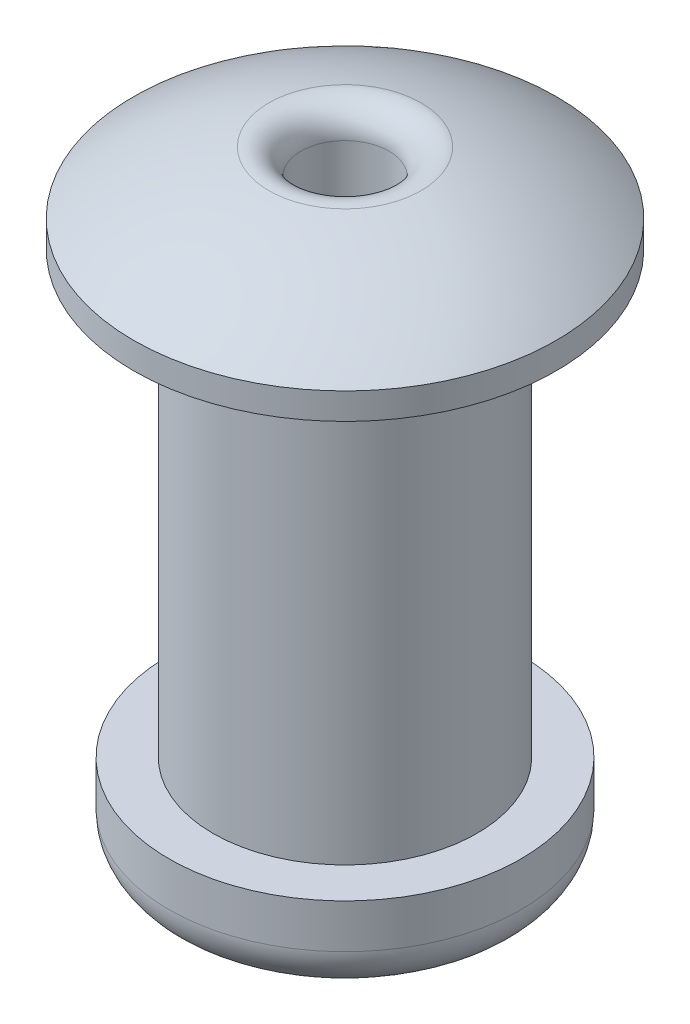
ISO-10303-21;
HEADER;
FILE_DESCRIPTION(('STEP AP214'),'2;1');
FILE_NAME('part.step','',(''),(''),'','','');
FILE_SCHEMA(('AUTOMOTIVE_DESIGN { 1 0 10303 214 1 1 1 1 }'));
ENDSEC;
DATA;
#1=APPLICATION_CONTEXT('core data for automotive mechanical design processes');
#2=APPLICATION_PROTOCOL_DEFINITION('international standard','automotive_design',2000,#1);
#3=PRODUCT_CONTEXT('',#1,'mechanical');
#4=PRODUCT('Part','Part','',(#3));
#5=PRODUCT_RELATED_PRODUCT_CATEGORY('part','',(#4));
#6=PRODUCT_DEFINITION_FORMATION('','',#4);
#7=PRODUCT_DEFINITION_CONTEXT('part definition',#1,'design');
#8=PRODUCT_DEFINITION('design','',#6,#7);
#9=PRODUCT_DEFINITION_SHAPE('','',#8);
#10=(LENGTH_UNIT() NAMED_UNIT(*) SI_UNIT(.MILLI.,.METRE.));
#11=(NAMED_UNIT(*) PLANE_ANGLE_UNIT() SI_UNIT($,.RADIAN.));
#12=(NAMED_UNIT(*) SI_UNIT($,.STERADIAN.) SOLID_ANGLE_UNIT());
#13=UNCERTAINTY_MEASURE_WITH_UNIT(LENGTH_MEASURE(1.E-05),#10,'distance_accuracy_value','');
#14=(GEOMETRIC_REPRESENTATION_CONTEXT(3) GLOBAL_UNCERTAINTY_ASSIGNED_CONTEXT((#13)) GLOBAL_UNIT_ASSIGNED_CONTEXT((#10,
#11,#12)) REPRESENTATION_CONTEXT('',''));
#15=CARTESIAN_POINT('',(0.,0.,0.));
#16=DIRECTION('',(0.,0.,1.));
#17=DIRECTION('',(1.,0.,0.));
#18=AXIS2_PLACEMENT_3D('',#15,#16,#17);
#19=CARTESIAN_POINT('',(0.,12.3128383024171,0.));
#20=DIRECTION('',(0.,-1.,0.));
#21=DIRECTION('',(0.,0.,-1.));
#22=AXIS2_PLACEMENT_3D('',#19,#20,#21);
#23=PLANE('',#22);
#24=CARTESIAN_POINT('',(0.,12.3128383024171,0.));
#25=DIRECTION('',(0.,-1.,0.));
#26=DIRECTION('',(0.,0.,-1.));
#27=AXIS2_PLACEMENT_3D('',#24,#25,#26);
#28=CIRCLE('',#27,0.5);
#29=CARTESIAN_POINT('',(0.,12.3128383024171,-0.5));
#30=VERTEX_POINT('',#29);
#31=EDGE_CURVE('E47',#30,#30,#28,.F.);
#32=ORIENTED_EDGE('',*,*,#31,.T.);
#33=EDGE_LOOP('',(#32));
#34=FACE_BOUND('',#33,.T.);
#35=ADVANCED_FACE('F16',(#34),#23,.F.);
#36=CARTESIAN_POINT('',(0.,0.,0.));
#37=DIRECTION('',(0.,-1.,0.));
#38=DIRECTION('',(0.,0.,-1.));
#39=AXIS2_PLACEMENT_3D('',#36,#37,#38);
#40=CYLINDRICAL_SURFACE('',#39,0.5);
#41=CARTESIAN_POINT('',(0.,14.4566897094579,0.));
#42=DIRECTION('',(0.,-1.,0.));
#43=DIRECTION('',(0.,0.,-1.));
#44=AXIS2_PLACEMENT_3D('',#41,#42,#43);
#45=CIRCLE('',#44,0.5);
#46=CARTESIAN_POINT('',(0.,14.4566897094579,-0.5));
#47=VERTEX_POINT('',#46);
#48=EDGE_CURVE('E50',#47,#47,#45,.T.);
#49=ORIENTED_EDGE('',*,*,#48,.F.);
#50=EDGE_LOOP('',(#49));
#51=FACE_BOUND('',#50,.T.);
#52=ORIENTED_EDGE('',*,*,#31,.F.);
#53=EDGE_LOOP('',(#52));
#54=FACE_BOUND('',#53,.T.);
#55=ADVANCED_FACE('F74',(#51,#54),#40,.F.);
#56=CARTESIAN_POINT('',(0.,14.4566897094579,0.));
#57=DIRECTION('',(0.,-1.,0.));
#58=DIRECTION('',(0.,0.,-1.));
#59=AXIS2_PLACEMENT_3D('',#56,#57,#58);
#60=TOROIDAL_SURFACE('',#59,0.8,0.3);
#61=CARTESIAN_POINT('',(0.,14.7495933613745,0.));
#62=DIRECTION('',(0.,-1.,0.));
#63=DIRECTION('',(0.,0.,-1.));
#64=AXIS2_PLACEMENT_3D('',#61,#62,#63);
#65=CIRCLE('',#64,0.864864864864865);
#66=CARTESIAN_POINT('',(0.,14.7495933613745,-0.864864864864865));
#67=VERTEX_POINT('',#66);
#68=EDGE_CURVE('E45',#67,#67,#65,.T.);
#69=ORIENTED_EDGE('',*,*,#68,.F.);
#70=EDGE_LOOP('',(#69));
#71=FACE_BOUND('',#70,.T.);
#72=ORIENTED_EDGE('',*,*,#48,.T.);
#73=EDGE_LOOP('',(#72));
#74=FACE_BOUND('',#73,.T.);
#75=ADVANCED_FACE('F71',(#71,#74),#60,.T.);
#76=CARTESIAN_POINT('',(-2.,7.74421133582024,0.));
#77=DIRECTION('',(0.,1.,0.));
#78=DIRECTION('',(0.,0.,1.));
#79=AXIS2_PLACEMENT_3D('',#76,#77,#78);
#80=PLANE('',#79);
#81=CARTESIAN_POINT('',(0.,7.74421133582024,0.));
#82=DIRECTION('',(0.,1.,0.));
#83=DIRECTION('',(0.,0.,1.));
#84=AXIS2_PLACEMENT_3D('',#81,#82,#83);
#85=CIRCLE('',#84,1.5);
#86=CARTESIAN_POINT('',(0.,7.74421133582024,1.5));
#87=VERTEX_POINT('',#86);
#88=CARTESIAN_POINT('',(0.,7.74421133582024,-1.5));
#89=VERTEX_POINT('',#88);
#90=EDGE_CURVE('E36',#87,#89,#85,.T.);
#91=ORIENTED_EDGE('',*,*,#90,.F.);
#92=CARTESIAN_POINT('',(0.,7.74421133582024,0.));
#93=DIRECTION('',(0.,1.,0.));
#94=DIRECTION('',(0.,0.,-1.));
#95=AXIS2_PLACEMENT_3D('',#92,#93,#94);
#96=CIRCLE('',#95,1.5);
#97=EDGE_CURVE('E33',#89,#87,#96,.T.);
#98=ORIENTED_EDGE('',*,*,#97,.F.);
#99=EDGE_LOOP('',(#91,#98));
#100=FACE_BOUND('',#99,.T.);
#101=ADVANCED_FACE('F38',(#100),#80,.F.);
#102=CARTESIAN_POINT('',(0.,10.8442113358202,0.));
#103=DIRECTION('',(-1.,0.,0.));
#104=DIRECTION('',(0.,1.,0.));
#105=AXIS2_PLACEMENT_3D('',#102,#103,#104);
#106=SPHERICAL_SURFACE('',#105,4.);
#107=CARTESIAN_POINT('',(0.,14.0442113358202,0.));
#108=DIRECTION('',(0.,-1.,0.));
#109=DIRECTION('',(0.,0.,-1.));
#110=AXIS2_PLACEMENT_3D('',#107,#108,#109);
#111=CIRCLE('',#110,2.4);
#112=CARTESIAN_POINT('',(0.,14.0442113358202,-2.4));
#113=VERTEX_POINT('',#112);
#114=EDGE_CURVE('E41',#113,#113,#111,.T.);
#115=ORIENTED_EDGE('',*,*,#114,.F.);
#116=EDGE_LOOP('',(#115));
#117=FACE_BOUND('',#116,.T.);
#118=ORIENTED_EDGE('',*,*,#68,.T.);
#119=EDGE_LOOP('',(#118));
#120=FACE_BOUND('',#119,.T.);
#121=ADVANCED_FACE('F113',(#117,#120),#106,.T.);
#122=CARTESIAN_POINT('',(0.,8.24421133582024,0.));
#123=DIRECTION('',(0.,1.,0.));
#124=DIRECTION('',(0.,0.,1.));
#125=AXIS2_PLACEMENT_3D('',#122,#123,#124);
#126=TOROIDAL_SURFACE('',#125,1.5,0.5);
#127=CARTESIAN_POINT('',(0.,8.24421133582024,0.));
#128=DIRECTION('',(0.,-1.,0.));
#129=DIRECTION('',(0.,0.,-1.));
#130=AXIS2_PLACEMENT_3D('',#127,#128,#129);
#131=CIRCLE('',#130,2.);
#132=CARTESIAN_POINT('',(0.,8.24421133582024,-2.));
#133=VERTEX_POINT('',#132);
#134=EDGE_CURVE('E55',#133,#133,#131,.F.);
#135=ORIENTED_EDGE('',*,*,#134,.F.);
#136=EDGE_LOOP('',(#135));
#137=FACE_BOUND('',#136,.T.);
#138=ORIENTED_EDGE('',*,*,#90,.T.);
#139=ORIENTED_EDGE('',*,*,#97,.T.);
#140=EDGE_LOOP('',(#138,#139));
#141=FACE_BOUND('',#140,.T.);
#142=ADVANCED_FACE('F44',(#137,#141),#126,.T.);
#143=CARTESIAN_POINT('',(0.,0.,0.));
#144=DIRECTION('',(0.,-1.,0.));
#145=DIRECTION('',(0.,0.,-1.));
#146=AXIS2_PLACEMENT_3D('',#143,#144,#145);
#147=CYLINDRICAL_SURFACE('',#146,2.4);
#148=CARTESIAN_POINT('',(0.,13.7442113358202,0.));
#149=DIRECTION('',(0.,-1.,0.));
#150=DIRECTION('',(0.,0.,-1.));
#151=AXIS2_PLACEMENT_3D('',#148,#149,#150);
#152=CIRCLE('',#151,2.4);
#153=CARTESIAN_POINT('',(0.,13.7442113358202,-2.4));
#154=VERTEX_POINT('',#153);
#155=EDGE_CURVE('E56',#154,#154,#152,.F.);
#156=ORIENTED_EDGE('',*,*,#155,.T.);
#157=EDGE_LOOP('',(#156));
#158=FACE_BOUND('',#157,.T.);
#159=ORIENTED_EDGE('',*,*,#114,.T.);
#160=EDGE_LOOP('',(#159));
#161=FACE_BOUND('',#160,.T.);
#162=ADVANCED_FACE('F106',(#158,#161),#147,.T.);
#163=CARTESIAN_POINT('',(0.,0.,0.));
#164=DIRECTION('',(0.,-1.,0.));
#165=DIRECTION('',(0.,0.,-1.));
#166=AXIS2_PLACEMENT_3D('',#163,#164,#165);
#167=CYLINDRICAL_SURFACE('',#166,2.);
#168=ORIENTED_EDGE('',*,*,#134,.T.);
#169=EDGE_LOOP('',(#168));
#170=FACE_BOUND('',#169,.T.);
#171=CARTESIAN_POINT('',(0.,8.74421133582024,0.));
#172=DIRECTION('',(0.,-1.,0.));
#173=DIRECTION('',(0.,0.,-1.));
#174=AXIS2_PLACEMENT_3D('',#171,#172,#173);
#175=CIRCLE('',#174,2.);
#176=CARTESIAN_POINT('',(0.,8.74421133582024,-2.));
#177=VERTEX_POINT('',#176);
#178=EDGE_CURVE('E59',#177,#177,#175,.T.);
#179=ORIENTED_EDGE('',*,*,#178,.T.);
#180=EDGE_LOOP('',(#179));
#181=FACE_BOUND('',#180,.T.);
#182=ADVANCED_FACE('F102',(#170,#181),#167,.T.);
#183=CARTESIAN_POINT('',(-2.4,13.7442113358202,0.));
#184=DIRECTION('',(0.,1.,0.));
#185=DIRECTION('',(0.,0.,1.));
#186=AXIS2_PLACEMENT_3D('',#183,#184,#185);
#187=PLANE('',#186);
#188=ORIENTED_EDGE('',*,*,#155,.F.);
#189=EDGE_LOOP('',(#188));
#190=FACE_BOUND('',#189,.T.);
#191=CARTESIAN_POINT('',(0.,13.7442113358202,0.));
#192=DIRECTION('',(0.,-1.,0.));
#193=DIRECTION('',(0.,0.,-1.));
#194=AXIS2_PLACEMENT_3D('',#191,#192,#193);
#195=CIRCLE('',#194,1.5);
#196=CARTESIAN_POINT('',(0.,13.7442113358202,-1.5));
#197=VERTEX_POINT('',#196);
#198=EDGE_CURVE('E26',#197,#197,#195,.T.);
#199=ORIENTED_EDGE('',*,*,#198,.F.);
#200=EDGE_LOOP('',(#199));
#201=FACE_BOUND('',#200,.T.);
#202=ADVANCED_FACE('F95',(#190,#201),#187,.F.);
#203=CARTESIAN_POINT('',(-1.5,8.74421133582024,0.));
#204=DIRECTION('',(0.,-1.,0.));
#205=DIRECTION('',(0.,0.,-1.));
#206=AXIS2_PLACEMENT_3D('',#203,#204,#205);
#207=PLANE('',#206);
#208=CARTESIAN_POINT('',(0.,8.74421133582024,0.));
#209=DIRECTION('',(0.,-1.,0.));
#210=DIRECTION('',(0.,0.,-1.));
#211=AXIS2_PLACEMENT_3D('',#208,#209,#210);
#212=CIRCLE('',#211,1.5);
#213=CARTESIAN_POINT('',(0.,8.74421133582024,-1.5));
#214=VERTEX_POINT('',#213);
#215=EDGE_CURVE('E11',#214,#214,#212,.F.);
#216=ORIENTED_EDGE('',*,*,#215,.F.);
#217=EDGE_LOOP('',(#216));
#218=FACE_BOUND('',#217,.T.);
#219=ORIENTED_EDGE('',*,*,#178,.F.);
#220=EDGE_LOOP('',(#219));
#221=FACE_BOUND('',#220,.T.);
#222=ADVANCED_FACE('F89',(#218,#221),#207,.F.);
#223=CARTESIAN_POINT('',(0.,0.,0.));
#224=DIRECTION('',(0.,-1.,0.));
#225=DIRECTION('',(0.,0.,-1.));
#226=AXIS2_PLACEMENT_3D('',#223,#224,#225);
#227=CYLINDRICAL_SURFACE('',#226,1.5);
#228=ORIENTED_EDGE('',*,*,#215,.T.);
#229=EDGE_LOOP('',(#228));
#230=FACE_BOUND('',#229,.T.);
#231=ORIENTED_EDGE('',*,*,#198,.T.);
#232=EDGE_LOOP('',(#231));
#233=FACE_BOUND('',#232,.T.);
#234=ADVANCED_FACE('F87',(#230,#233),#227,.T.);
#235=CLOSED_SHELL('',(#35,#55,#75,#101,#121,#142,#162,#182,#202,#222,#234));
#236=MANIFOLD_SOLID_BREP('B1',#235);
#237=ADVANCED_BREP_SHAPE_REPRESENTATION('',(#18,#236),#14);
#238=SHAPE_DEFINITION_REPRESENTATION(#9,#237);
ENDSEC;
END-ISO-10303-21;
